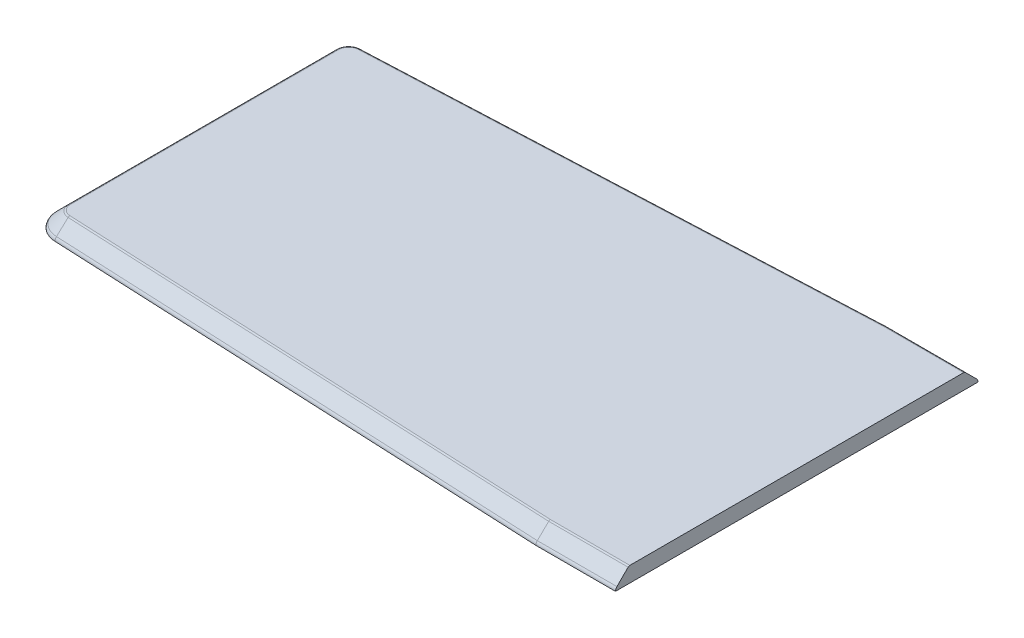
ISO-10303-21;
HEADER;
FILE_DESCRIPTION(('STEP AP214'),'2;1');
FILE_NAME('part.step','',(''),(''),'','','');
FILE_SCHEMA(('AUTOMOTIVE_DESIGN { 1 0 10303 214 1 1 1 1 }'));
ENDSEC;
DATA;
#1=APPLICATION_CONTEXT('core data for automotive mechanical design processes');
#2=APPLICATION_PROTOCOL_DEFINITION('international standard','automotive_design',2000,#1);
#3=PRODUCT_CONTEXT('',#1,'mechanical');
#4=PRODUCT('Part','Part','',(#3));
#5=PRODUCT_RELATED_PRODUCT_CATEGORY('part','',(#4));
#6=PRODUCT_DEFINITION_FORMATION('','',#4);
#7=PRODUCT_DEFINITION_CONTEXT('part definition',#1,'design');
#8=PRODUCT_DEFINITION('design','',#6,#7);
#9=PRODUCT_DEFINITION_SHAPE('','',#8);
#10=(LENGTH_UNIT() NAMED_UNIT(*) SI_UNIT(.MILLI.,.METRE.));
#11=(NAMED_UNIT(*) PLANE_ANGLE_UNIT() SI_UNIT($,.RADIAN.));
#12=(NAMED_UNIT(*) SI_UNIT($,.STERADIAN.) SOLID_ANGLE_UNIT());
#13=UNCERTAINTY_MEASURE_WITH_UNIT(LENGTH_MEASURE(1.E-05),#10,'distance_accuracy_value','');
#14=(GEOMETRIC_REPRESENTATION_CONTEXT(3) GLOBAL_UNCERTAINTY_ASSIGNED_CONTEXT((#13)) GLOBAL_UNIT_ASSIGNED_CONTEXT((#10,
#11,#12)) REPRESENTATION_CONTEXT('',''));
#15=CARTESIAN_POINT('',(0.,0.,0.));
#16=DIRECTION('',(0.,0.,1.));
#17=DIRECTION('',(1.,0.,0.));
#18=AXIS2_PLACEMENT_3D('',#15,#16,#17);
#19=CARTESIAN_POINT('',(-20.2949627924089,-0.253999999999999,14.0434754923325));
#20=DIRECTION('',(0.,-1.,0.));
#21=DIRECTION('',(0.,0.,-1.));
#22=AXIS2_PLACEMENT_3D('',#19,#20,#21);
#23=TOROIDAL_SURFACE('',#22,1.0377897551572,0.253999999999999);
#24=CARTESIAN_POINT('',(-21.3327525475661,-0.253999999999986,14.0434754923324));
#25=DIRECTION('',(0.,-1.84046289331525E-13,1.));
#26=DIRECTION('',(0.,-1.,-1.84046289331525E-13));
#27=AXIS2_PLACEMENT_3D('',#24,#25,#26);
#28=CIRCLE('',#27,0.253999999999988);
#29=CARTESIAN_POINT('',(-21.3327525475661,0.,14.0434754923325));
#30=VERTEX_POINT('',#29);
#31=CARTESIAN_POINT('',(-21.5123576700085,-0.0743948776107095,14.0434754923325));
#32=VERTEX_POINT('',#31);
#33=EDGE_CURVE('E139',#30,#32,#28,.T.);
#34=ORIENTED_EDGE('',*,*,#33,.T.);
#35=CARTESIAN_POINT('',(-20.2949627924089,-0.0743948776289471,14.0434754923325));
#36=DIRECTION('',(0.,-1.,0.));
#37=DIRECTION('',(0.,0.,-1.));
#38=AXIS2_PLACEMENT_3D('',#35,#36,#37);
#39=CIRCLE('',#38,1.21739487760293);
#40=CARTESIAN_POINT('',(-20.3501874617926,-0.0743948776756947,15.2596171469268));
#41=VERTEX_POINT('',#40);
#42=EDGE_CURVE('E148',#41,#32,#39,.T.);
#43=ORIENTED_EDGE('',*,*,#42,.F.);
#44=CARTESIAN_POINT('',(-20.3420400367522,-0.253999999999999,15.0801969153649));
#45=DIRECTION('',(-0.998970569790741,1.13105535473192E-13,-0.0453629881286821));
#46=DIRECTION('',(-0.0453629881286821,0.,0.998970569790741));
#47=AXIS2_PLACEMENT_3D('',#44,#45,#46);
#48=CIRCLE('',#47,0.253999999999999);
#49=CARTESIAN_POINT('',(-20.3420400367524,0.,15.0801969153649));
#50=VERTEX_POINT('',#49);
#51=EDGE_CURVE('E108',#41,#50,#48,.T.);
#52=ORIENTED_EDGE('',*,*,#51,.T.);
#53=CARTESIAN_POINT('',(-20.2949627924089,0.,14.0434754923325));
#54=DIRECTION('',(0.,-1.,0.));
#55=DIRECTION('',(0.,0.,-1.));
#56=AXIS2_PLACEMENT_3D('',#53,#54,#55);
#57=CIRCLE('',#56,1.0377897551572);
#58=EDGE_CURVE('E172',#50,#30,#57,.T.);
#59=ORIENTED_EDGE('',*,*,#58,.T.);
#60=EDGE_LOOP('',(#34,#43,#52,#59));
#61=FACE_BOUND('',#60,.T.);
#62=ADVANCED_FACE('F35',(#61),#23,.T.);
#63=CARTESIAN_POINT('',(-20.2949627924089,-0.253999999999973,-14.0434754923325));
#64=DIRECTION('',(0.,-1.,0.));
#65=DIRECTION('',(0.,0.,-1.));
#66=AXIS2_PLACEMENT_3D('',#63,#64,#65);
#67=TOROIDAL_SURFACE('',#66,1.03778975515721,0.253999999999976);
#68=CARTESIAN_POINT('',(-21.3327525475661,-0.253999999999973,-14.0434754923325));
#69=DIRECTION('',(0.,0.,-1.));
#70=DIRECTION('',(0.,1.,0.));
#71=AXIS2_PLACEMENT_3D('',#68,#69,#70);
#72=CIRCLE('',#71,0.253999999999976);
#73=CARTESIAN_POINT('',(-21.5123576699768,-0.0743948775736566,-14.0434754923325));
#74=VERTEX_POINT('',#73);
#75=CARTESIAN_POINT('',(-21.3327525475661,0.,-14.0434754923325));
#76=VERTEX_POINT('',#75);
#77=EDGE_CURVE('E207',#74,#76,#72,.T.);
#78=ORIENTED_EDGE('',*,*,#77,.T.);
#79=CARTESIAN_POINT('',(-20.2949627924089,0.,-14.0434754923325));
#80=DIRECTION('',(0.,-1.,0.));
#81=DIRECTION('',(0.,0.,-1.));
#82=AXIS2_PLACEMENT_3D('',#79,#80,#81);
#83=CIRCLE('',#82,1.03778975515721);
#84=CARTESIAN_POINT('',(-20.3420400367527,0.,-15.0801969153649));
#85=VERTEX_POINT('',#84);
#86=EDGE_CURVE('E206',#76,#85,#83,.T.);
#87=ORIENTED_EDGE('',*,*,#86,.T.);
#88=CARTESIAN_POINT('',(-20.3420400367527,-0.254000000000003,-15.0801969153649));
#89=DIRECTION('',(-0.998970569790709,-2.085180915848E-13,0.0453629881293746));
#90=DIRECTION('',(0.0453629881293746,0.,0.998970569790709));
#91=AXIS2_PLACEMENT_3D('',#88,#89,#90);
#92=CIRCLE('',#91,0.254000000000002);
#93=CARTESIAN_POINT('',(-20.3501874617874,-0.0743948775482951,-15.2596171468191));
#94=VERTEX_POINT('',#93);
#95=EDGE_CURVE('E184',#85,#94,#92,.T.);
#96=ORIENTED_EDGE('',*,*,#95,.T.);
#97=CARTESIAN_POINT('',(-20.2949627924089,-0.0743948775721037,-14.0434754923325));
#98=DIRECTION('',(0.,-1.,0.));
#99=DIRECTION('',(0.,0.,-1.));
#100=AXIS2_PLACEMENT_3D('',#97,#98,#99);
#101=CIRCLE('',#100,1.21739487756771);
#102=EDGE_CURVE('E176',#74,#94,#101,.T.);
#103=ORIENTED_EDGE('',*,*,#102,.F.);
#104=EDGE_LOOP('',(#78,#87,#96,#103));
#105=FACE_BOUND('',#104,.T.);
#106=ADVANCED_FACE('F347',(#105),#67,.T.);
#107=CARTESIAN_POINT('',(-20.2949627924089,-1.24821024479616,14.0434754923325));
#108=DIRECTION('',(0.,-1.,0.));
#109=DIRECTION('',(0.,0.,-1.));
#110=AXIS2_PLACEMENT_3D('',#107,#108,#109);
#111=CONICAL_SURFACE('',#110,2.39121024488382,0.785398163445875);
#112=DIRECTION('',(0.0320764765218441,0.707106781169426,-0.706378864121908));
#113=VECTOR('',#112,1.);
#114=CARTESIAN_POINT('',(-22656.4778902727,-499000.,498501.49964856));
#115=LINE('',#114,#113);
#116=CARTESIAN_POINT('',(-20.4034352343629,-1.24821024487762,16.4322241531575));
#117=VERTEX_POINT('',#116);
#118=EDGE_CURVE('E145',#117,#41,#115,.T.);
#119=ORIENTED_EDGE('',*,*,#118,.T.);
#120=ORIENTED_EDGE('',*,*,#42,.T.);
#121=DIRECTION('',(0.707106781203669,0.707106781169426,0.));
#122=VECTOR('',#121,1.);
#123=CARTESIAN_POINT('',(-499021.437986957,-499000.,14.0434754924242));
#124=LINE('',#123,#122);
#125=CARTESIAN_POINT('',(-22.6861730372638,-1.24821024483114,14.0434754923325));
#126=VERTEX_POINT('',#125);
#127=EDGE_CURVE('E155',#32,#126,#124,.F.);
#128=ORIENTED_EDGE('',*,*,#127,.T.);
#129=CARTESIAN_POINT('',(-20.2949627924089,-1.2482102448428,14.0434754923325));
#130=DIRECTION('',(0.,-1.,0.));
#131=DIRECTION('',(0.,0.,-1.));
#132=AXIS2_PLACEMENT_3D('',#129,#130,#131);
#133=CIRCLE('',#132,2.39121024484277);
#134=EDGE_CURVE('E151',#117,#126,#133,.T.);
#135=ORIENTED_EDGE('',*,*,#134,.F.);
#136=EDGE_LOOP('',(#119,#120,#128,#135));
#137=FACE_BOUND('',#136,.T.);
#138=ADVANCED_FACE('F147',(#137),#111,.T.);
#139=CARTESIAN_POINT('',(-20.2949627924089,-1.24821024479616,-14.0434754923325));
#140=DIRECTION('',(0.,-1.,0.));
#141=DIRECTION('',(0.,0.,-1.));
#142=AXIS2_PLACEMENT_3D('',#139,#140,#141);
#143=CONICAL_SURFACE('',#142,2.39121024484861,0.785398163421661);
#144=DIRECTION('',(0.0320764765218513,0.707106781169426,0.706378864121908));
#145=VECTOR('',#144,1.);
#146=CARTESIAN_POINT('',(-22655.7889852741,-498984.813500344,-498486.328782345));
#147=LINE('',#146,#145);
#148=CARTESIAN_POINT('',(-20.4034352343603,-1.2482102448312,-16.4322241531111));
#149=VERTEX_POINT('',#148);
#150=EDGE_CURVE('E240',#94,#149,#147,.F.);
#151=ORIENTED_EDGE('',*,*,#150,.T.);
#152=CARTESIAN_POINT('',(-20.2949627924089,-1.24821024484305,-14.0434754923325));
#153=DIRECTION('',(0.,-1.,0.));
#154=DIRECTION('',(1.,0.,0.));
#155=AXIS2_PLACEMENT_3D('',#152,#153,#154);
#156=CIRCLE('',#155,2.39121024484302);
#157=CARTESIAN_POINT('',(-22.6861730372497,-1.2482102448312,-14.0434754923325));
#158=VERTEX_POINT('',#157);
#159=EDGE_CURVE('E205',#158,#149,#156,.T.);
#160=ORIENTED_EDGE('',*,*,#159,.F.);
#161=DIRECTION('',(0.707106781203669,0.707106781169426,0.));
#162=VECTOR('',#161,1.);
#163=CARTESIAN_POINT('',(-499006.2514873,-498984.813500344,-14.0434754917976));
#164=LINE('',#163,#162);
#165=EDGE_CURVE('E174',#158,#74,#164,.T.);
#166=ORIENTED_EDGE('',*,*,#165,.T.);
#167=ORIENTED_EDGE('',*,*,#102,.T.);
#168=EDGE_LOOP('',(#151,#160,#166,#167));
#169=FACE_BOUND('',#168,.T.);
#170=ADVANCED_FACE('F340',(#169),#143,.T.);
#171=CARTESIAN_POINT('',(-20.2949627924089,-1.60742048968556,14.0434754923325));
#172=DIRECTION('',(0.,1.,0.));
#173=DIRECTION('',(0.,0.,1.));
#174=AXIS2_PLACEMENT_3D('',#171,#172,#173);
#175=TOROIDAL_SURFACE('',#174,2.03200000000001,0.50799999999999);
#176=CARTESIAN_POINT('',(-20.3871403842875,-1.60742048968558,16.0733836901472));
#177=DIRECTION('',(-0.998970569790715,0.,-0.0453629881292468));
#178=DIRECTION('',(-0.0453629881292468,0.,0.998970569790715));
#179=AXIS2_PLACEMENT_3D('',#176,#177,#178);
#180=CIRCLE('',#179,0.508);
#181=CARTESIAN_POINT('',(-20.4101847822572,-1.60742048968556,16.5808607396009));
#182=VERTEX_POINT('',#181);
#183=EDGE_CURVE('E204',#117,#182,#180,.F.);
#184=ORIENTED_EDGE('',*,*,#183,.F.);
#185=ORIENTED_EDGE('',*,*,#134,.T.);
#186=CARTESIAN_POINT('',(-22.3269627924089,-1.60742048968556,14.0434754923325));
#187=DIRECTION('',(0.,0.,-1.));
#188=DIRECTION('',(-1.,0.,0.));
#189=AXIS2_PLACEMENT_3D('',#186,#187,#188);
#190=CIRCLE('',#189,0.508000000000002);
#191=CARTESIAN_POINT('',(-22.8349627924089,-1.60742048968556,14.0434754923325));
#192=VERTEX_POINT('',#191);
#193=EDGE_CURVE('E274',#192,#126,#190,.T.);
#194=ORIENTED_EDGE('',*,*,#193,.F.);
#195=CARTESIAN_POINT('',(-20.2949627924089,-1.60742048968558,14.0434754923325));
#196=DIRECTION('',(0.,1.,0.));
#197=DIRECTION('',(0.,0.,1.));
#198=AXIS2_PLACEMENT_3D('',#195,#196,#197);
#199=CIRCLE('',#198,2.54);
#200=EDGE_CURVE('E271',#182,#192,#199,.F.);
#201=ORIENTED_EDGE('',*,*,#200,.F.);
#202=EDGE_LOOP('',(#184,#185,#194,#201));
#203=FACE_BOUND('',#202,.T.);
#204=ADVANCED_FACE('F343',(#203),#175,.T.);
#205=CARTESIAN_POINT('',(-20.2949627924089,-1.60742048968557,-14.0434754923325));
#206=DIRECTION('',(0.,1.,0.));
#207=DIRECTION('',(-1.,0.,0.));
#208=AXIS2_PLACEMENT_3D('',#205,#206,#207);
#209=TOROIDAL_SURFACE('',#208,2.03200000000004,0.507999999999963);
#210=CARTESIAN_POINT('',(-20.3871403842875,-1.60742048968558,-16.0733836901472));
#211=DIRECTION('',(-0.998970569790715,0.,0.0453629881292468));
#212=DIRECTION('',(0.0453629881292468,0.,0.998970569790715));
#213=AXIS2_PLACEMENT_3D('',#210,#211,#212);
#214=CIRCLE('',#213,0.508);
#215=CARTESIAN_POINT('',(-20.4101847822572,-1.60742048968556,-16.5808607396009));
#216=VERTEX_POINT('',#215);
#217=EDGE_CURVE('E277',#216,#149,#214,.F.);
#218=ORIENTED_EDGE('',*,*,#217,.F.);
#219=CARTESIAN_POINT('',(-20.2949627924089,-1.60742048968557,-14.0434754923325));
#220=DIRECTION('',(0.,1.,0.));
#221=DIRECTION('',(0.,0.,1.));
#222=AXIS2_PLACEMENT_3D('',#219,#220,#221);
#223=CIRCLE('',#222,2.54);
#224=CARTESIAN_POINT('',(-22.8349627924089,-1.60742048968556,-14.0434754923325));
#225=VERTEX_POINT('',#224);
#226=EDGE_CURVE('E293',#225,#216,#223,.F.);
#227=ORIENTED_EDGE('',*,*,#226,.F.);
#228=CARTESIAN_POINT('',(-22.3269627924089,-1.60742048968556,-14.0434754923325));
#229=DIRECTION('',(0.,0.,-1.));
#230=DIRECTION('',(-1.,0.,0.));
#231=AXIS2_PLACEMENT_3D('',#228,#229,#230);
#232=CIRCLE('',#231,0.508000000000002);
#233=EDGE_CURVE('E278',#158,#225,#232,.F.);
#234=ORIENTED_EDGE('',*,*,#233,.F.);
#235=ORIENTED_EDGE('',*,*,#159,.T.);
#236=EDGE_LOOP('',(#218,#227,#234,#235));
#237=FACE_BOUND('',#236,.T.);
#238=ADVANCED_FACE('F37',(#237),#209,.T.);
#239=CARTESIAN_POINT('',(76.6847186902732,-1.60742048968556,18.4676003163647));
#240=DIRECTION('',(-1.,0.,0.));
#241=DIRECTION('',(0.,0.,1.));
#242=AXIS2_PLACEMENT_3D('',#239,#240,#241);
#243=CYLINDRICAL_SURFACE('',#242,0.508000000000002);
#244=CARTESIAN_POINT('',(40.6650372075911,-1.60742048968556,18.4676003163647));
#245=DIRECTION('',(-1.,0.,0.));
#246=DIRECTION('',(0.,0.,1.));
#247=AXIS2_PLACEMENT_3D('',#244,#245,#246);
#248=CIRCLE('',#247,0.508000000000002);
#249=CARTESIAN_POINT('',(40.6650372075911,-1.60742048968556,18.9756003163647));
#250=VERTEX_POINT('',#249);
#251=CARTESIAN_POINT('',(40.6650372075911,-1.2482102448428,18.8268105612075));
#252=VERTEX_POINT('',#251);
#253=EDGE_CURVE('E202',#250,#252,#248,.T.);
#254=ORIENTED_EDGE('',*,*,#253,.T.);
#255=DIRECTION('',(1.,0.,0.));
#256=VECTOR('',#255,1.);
#257=CARTESIAN_POINT('',(-22.8349627924089,-1.2482102448428,18.8268105612075));
#258=LINE('',#257,#256);
#259=CARTESIAN_POINT('',(32.3294522397187,-1.24821024484282,18.8268105612074));
#260=VERTEX_POINT('',#259);
#261=EDGE_CURVE('E307',#252,#260,#258,.F.);
#262=ORIENTED_EDGE('',*,*,#261,.T.);
#263=CARTESIAN_POINT('',(32.3260757278338,-1.60742048968558,18.9756003163647));
#264=CARTESIAN_POINT('',(32.326075720097,-1.59953559859638,18.9756004602101));
#265=CARTESIAN_POINT('',(32.3260796312705,-1.59165071420106,18.9754167330627));
#266=CARTESIAN_POINT('',(32.3260954862385,-1.57584112848617,18.9746799208705));
#267=CARTESIAN_POINT('',(32.3261074878612,-1.56791655105397,18.97412417696));
#268=CARTESIAN_POINT('',(32.3261398386846,-1.55204545032391,18.9726364067087));
#269=CARTESIAN_POINT('',(32.3261602471526,-1.54409917742847,18.9717017095456));
#270=CARTESIAN_POINT('',(32.3262096772397,-1.52820322607462,18.9694501566977));
#271=CARTESIAN_POINT('',(32.3262387591829,-1.52025392663587,18.9681306259641));
#272=CARTESIAN_POINT('',(32.3263057645063,-1.50437111186466,18.965104362101));
#273=CARTESIAN_POINT('',(32.3263437489813,-1.49643810607115,18.9633949556816));
#274=CARTESIAN_POINT('',(32.3264287438687,-1.48060767716884,18.9595848582972));
#275=CARTESIAN_POINT('',(32.3264758158227,-1.47271089568253,18.9574815025306));
#276=CARTESIAN_POINT('',(32.326579124966,-1.45697328263641,18.9528804208989));
#277=CARTESIAN_POINT('',(32.3266354238189,-1.44913322602213,18.9503800455081));
#278=CARTESIAN_POINT('',(32.3267572781233,-1.43352995286496,18.9449828948273));
#279=CARTESIAN_POINT('',(32.3268228950256,-1.42576764547823,18.9420834923));
#280=CARTESIAN_POINT('',(32.3269634265621,-1.4103412340726,18.9358873641133));
#281=CARTESIAN_POINT('',(32.3270384020925,-1.40267817394067,18.9325880406766));
#282=CARTESIAN_POINT('',(32.3271976394654,-1.38747203915708,18.925592305075));
#283=CARTESIAN_POINT('',(32.3272819613012,-1.37993014325695,18.92189333192));
#284=CARTESIAN_POINT('',(32.3274598251341,-1.36498847961361,18.914099736931));
#285=CARTESIAN_POINT('',(32.3275534258678,-1.35759002522014,18.9100025983509));
#286=CARTESIAN_POINT('',(32.3277497244444,-1.34295768351517,18.9014153658114));
#287=CARTESIAN_POINT('',(32.3278524794083,-1.33572524345758,18.8969228069294));
#288=CARTESIAN_POINT('',(32.3280669048054,-1.32144760328891,18.8875487181609));
#289=CARTESIAN_POINT('',(32.3281786303832,-1.31440398324177,18.8826647828076));
#290=CARTESIAN_POINT('',(32.3284107538833,-1.3005267993857,18.8725132776904));
#291=CARTESIAN_POINT('',(32.328531204603,-1.2936949467818,18.8672433697541));
#292=CARTESIAN_POINT('',(32.3287804761314,-1.28026425299219,18.8563265664568));
#293=CARTESIAN_POINT('',(32.3289093470451,-1.27366725249649,18.8506774075746));
#294=CARTESIAN_POINT('',(32.3291750808957,-1.26072900847476,18.8390103892465));
#295=CARTESIAN_POINT('',(32.3293119907992,-1.2543897312189,18.8329903502619));
#296=CARTESIAN_POINT('',(32.3294522397224,-1.24821024484284,18.8268105612075));
#297=B_SPLINE_CURVE_WITH_KNOTS('',3,(#263,#264,#265,#266,#267,#268,#269,#270,#271,#272,#273,
#274,#275,#276,#277,#278,#279,#280,#281,#282,#283,#284,#285,#286,#287,#288,#289,#290,#291,#292,
#293,#294,#295,#296),.UNSPECIFIED.,.F.,.F.,(4,2,2,2,2,2,2,2,2,2,2,2,2,2,2,2,4),(0.,
0.0236525306334769,0.0474759408318611,0.0714702585061957,0.0956355109561967,0.119971724887197,
0.144478926426512,0.169157141139235,0.194006394043511,0.219026709625274,0.244218111852504,
0.269580624189009,0.295114269607735,0.320819070603648,0.346695049206207,0.372742226991394,
0.398960625093405),.UNSPECIFIED.);
#298=CARTESIAN_POINT('',(32.326075727832,-1.60742048968556,18.9756003163646));
#299=VERTEX_POINT('',#298);
#300=EDGE_CURVE('E283',#299,#260,#297,.T.);
#301=ORIENTED_EDGE('',*,*,#300,.F.);
#302=DIRECTION('',(-1.,0.,0.));
#303=VECTOR('',#302,1.);
#304=CARTESIAN_POINT('',(76.6847186902732,-1.60742048968558,18.9756003163647));
#305=LINE('',#304,#303);
#306=EDGE_CURVE('E117',#299,#250,#305,.F.);
#307=ORIENTED_EDGE('',*,*,#306,.T.);
#308=EDGE_LOOP('',(#254,#262,#301,#307));
#309=FACE_BOUND('',#308,.T.);
#310=ADVANCED_FACE('F334',(#309),#243,.T.);
#311=CARTESIAN_POINT('',(32.3491201258035,-1.60742048968558,18.468123266911));
#312=DIRECTION('',(-0.998970569790715,0.,-0.0453629881292468));
#313=DIRECTION('',(-0.0453629881292468,0.,0.998970569790715));
#314=AXIS2_PLACEMENT_3D('',#311,#312,#313);
#315=CYLINDRICAL_SURFACE('',#314,0.508);
#316=ORIENTED_EDGE('',*,*,#300,.T.);
#317=DIRECTION('',(-0.998970569790746,-6.83294786936584E-13,-0.0453629881285643));
#318=VECTOR('',#317,1.);
#319=CARTESIAN_POINT('',(32.3294522397224,-1.24821024484284,18.8268105612075));
#320=LINE('',#319,#318);
#321=EDGE_CURVE('E257',#260,#117,#320,.T.);
#322=ORIENTED_EDGE('',*,*,#321,.T.);
#323=ORIENTED_EDGE('',*,*,#183,.T.);
#324=DIRECTION('',(-0.998970569790715,0.,-0.0453629881292468));
#325=VECTOR('',#324,1.);
#326=CARTESIAN_POINT('',(32.3260757278339,-1.60742048968556,18.9756003163647));
#327=LINE('',#326,#325);
#328=EDGE_CURVE('E266',#182,#299,#327,.F.);
#329=ORIENTED_EDGE('',*,*,#328,.T.);
#330=EDGE_LOOP('',(#316,#322,#323,#329));
#331=FACE_BOUND('',#330,.T.);
#332=ADVANCED_FACE('F323',(#331),#315,.T.);
#333=CARTESIAN_POINT('',(-22.3269627924089,-1.60742048968556,19.05));
#334=DIRECTION('',(0.,0.,-1.));
#335=DIRECTION('',(-1.,0.,0.));
#336=AXIS2_PLACEMENT_3D('',#333,#334,#335);
#337=CYLINDRICAL_SURFACE('',#336,0.508000000000002);
#338=ORIENTED_EDGE('',*,*,#193,.T.);
#339=DIRECTION('',(0.,0.,1.));
#340=VECTOR('',#339,1.);
#341=CARTESIAN_POINT('',(-22.6861730372516,-1.2482102448428,19.05));
#342=LINE('',#341,#340);
#343=EDGE_CURVE('E253',#126,#158,#342,.F.);
#344=ORIENTED_EDGE('',*,*,#343,.T.);
#345=ORIENTED_EDGE('',*,*,#233,.T.);
#346=DIRECTION('',(0.,0.,-1.));
#347=VECTOR('',#346,1.);
#348=CARTESIAN_POINT('',(-22.8349627924089,-1.60742048968557,19.05));
#349=LINE('',#348,#347);
#350=EDGE_CURVE('E288',#225,#192,#349,.F.);
#351=ORIENTED_EDGE('',*,*,#350,.T.);
#352=EDGE_LOOP('',(#338,#344,#345,#351));
#353=FACE_BOUND('',#352,.T.);
#354=ADVANCED_FACE('F333',(#353),#337,.T.);
#355=CARTESIAN_POINT('',(32.3491201258035,-1.60742048968558,-18.468123266911));
#356=DIRECTION('',(-0.998970569790715,0.,0.0453629881292468));
#357=DIRECTION('',(0.0453629881292468,0.,0.998970569790715));
#358=AXIS2_PLACEMENT_3D('',#355,#356,#357);
#359=CYLINDRICAL_SURFACE('',#358,0.508);
#360=CARTESIAN_POINT('',(32.3260757278338,-1.60742048968556,-18.9756003163647));
#361=CARTESIAN_POINT('',(32.3260757358811,-1.59953519995174,-18.975600460441));
#362=CARTESIAN_POINT('',(32.3260801695091,-1.59164991692258,-18.975416726415));
#363=CARTESIAN_POINT('',(32.3260977668045,-1.57583958963069,-18.9746798816196));
#364=CARTESIAN_POINT('',(32.3261109932498,-1.56791466915194,-18.9741241144541));
#365=CARTESIAN_POINT('',(32.3261461756655,-1.55204293992752,-18.9726362789587));
#366=CARTESIAN_POINT('',(32.3261681935204,-1.54409638137254,-18.9717015422527));
#367=CARTESIAN_POINT('',(32.3262209600102,-1.52819991753939,-18.9694498930867));
#368=CARTESIAN_POINT('',(32.3262517696674,-1.52025039095636,-18.9681303080037));
#369=CARTESIAN_POINT('',(32.3263221205145,-1.50436718128671,-18.9651039206695));
#370=CARTESIAN_POINT('',(32.3263617218787,-1.49643400729747,-18.9633944475352));
#371=CARTESIAN_POINT('',(32.3264496570062,-1.4806033012297,-18.9595842054863));
#372=CARTESIAN_POINT('',(32.326498050114,-1.47270641021105,-18.9574807741595));
#373=CARTESIAN_POINT('',(32.3266035695425,-1.45696863642909,-18.9528795347529));
#374=CARTESIAN_POINT('',(32.3266607543944,-1.44912852792391,-18.9503790795207));
#375=CARTESIAN_POINT('',(32.3267838581181,-1.43352520766893,-18.9449817681283));
#376=CARTESIAN_POINT('',(32.3268498347243,-1.42576290425974,-18.9420822870886));
#377=CARTESIAN_POINT('',(32.3269905227445,-1.41033655509102,-18.9358860075052));
#378=CARTESIAN_POINT('',(32.3270652911121,-1.40267355227174,-18.9325866135274));
#379=CARTESIAN_POINT('',(32.3272235634285,-1.38746758323119,-18.9255907501459));
#380=CARTESIAN_POINT('',(32.3273071235656,-1.37992579468093,-18.9218917220812));
#381=CARTESIAN_POINT('',(32.3274829801773,-1.36498439292996,-18.9140980392464));
#382=CARTESIAN_POINT('',(32.3275753320898,-1.35758609186252,-18.9100008700456));
#383=CARTESIAN_POINT('',(32.3277687730004,-1.34295409932287,-18.9014136078851));
#384=CARTESIAN_POINT('',(32.3278699167008,-1.33572185375048,-18.8969210523043));
#385=CARTESIAN_POINT('',(32.3280809418956,-1.32144463964403,-18.8875470123476));
#386=CARTESIAN_POINT('',(32.328190877371,-1.31440124968102,-18.8826631247921));
#387=CARTESIAN_POINT('',(32.3284194869049,-1.30052455694327,-18.8725117690032));
#388=CARTESIAN_POINT('',(32.3285382142378,-1.29369296374141,-18.8672419648697));
#389=CARTESIAN_POINT('',(32.3287844079033,-1.28026281285884,-18.8563254352441));
#390=CARTESIAN_POINT('',(32.3289119268147,-1.27366609409632,-18.8506764484872));
#391=CARTESIAN_POINT('',(32.3291757053938,-1.2607284301673,-18.8390098539145));
#392=CARTESIAN_POINT('',(32.3293120169671,-1.25438944936159,-18.8329900687999));
#393=CARTESIAN_POINT('',(32.3294522397242,-1.2482102448428,-18.8268105612075));
#394=B_SPLINE_CURVE_WITH_KNOTS('',3,(#360,#361,#362,#363,#364,#365,#366,#367,#368,#369,#370,
#371,#372,#373,#374,#375,#376,#377,#378,#379,#380,#381,#382,#383,#384,#385,#386,#387,#388,#389,
#390,#391,#392,#393),.UNSPECIFIED.,.F.,.F.,(4,2,2,2,2,2,2,2,2,2,2,2,2,2,2,2,4),(0.,
0.0236537262262262,0.0474781726179967,0.0714733670810794,0.0956393369106486,0.119976108808196,
0.144483708897855,0.169162162742176,0.194011495357352,0.219031731227942,0.244222894321089,
0.269585008100277,0.295118095538617,0.320822179131713,0.34669728091009,0.37274342245123,
0.398960624891214),.UNSPECIFIED.);
#395=CARTESIAN_POINT('',(32.3260757278339,-1.60742048968556,-18.9756003163647));
#396=VERTEX_POINT('',#395);
#397=CARTESIAN_POINT('',(32.3294522397242,-1.2482102448428,-18.8268105612075));
#398=VERTEX_POINT('',#397);
#399=EDGE_CURVE('E201',#396,#398,#394,.T.);
#400=ORIENTED_EDGE('',*,*,#399,.F.);
#401=DIRECTION('',(0.998970569790715,0.,-0.0453629881292468));
#402=VECTOR('',#401,1.);
#403=CARTESIAN_POINT('',(32.3260757278339,-1.60742048968555,-18.9756003163647));
#404=LINE('',#403,#402);
#405=EDGE_CURVE('E298',#396,#216,#404,.F.);
#406=ORIENTED_EDGE('',*,*,#405,.T.);
#407=ORIENTED_EDGE('',*,*,#217,.T.);
#408=DIRECTION('',(0.998970569790715,0.,-0.0453629881292467));
#409=VECTOR('',#408,1.);
#410=CARTESIAN_POINT('',(-20.4034352343602,-1.24821024484281,-16.4322241531125));
#411=LINE('',#410,#409);
#412=EDGE_CURVE('E256',#149,#398,#411,.T.);
#413=ORIENTED_EDGE('',*,*,#412,.T.);
#414=EDGE_LOOP('',(#400,#406,#407,#413));
#415=FACE_BOUND('',#414,.T.);
#416=ADVANCED_FACE('F405',(#415),#359,.T.);
#417=CARTESIAN_POINT('',(76.6847186902732,-1.60742048968556,-18.4676003163647));
#418=DIRECTION('',(-1.,0.,0.));
#419=DIRECTION('',(0.,0.,1.));
#420=AXIS2_PLACEMENT_3D('',#417,#418,#419);
#421=CYLINDRICAL_SURFACE('',#420,0.508000000000002);
#422=CARTESIAN_POINT('',(40.6650372075911,-1.60742048968556,-18.4676003163647));
#423=DIRECTION('',(-1.,0.,0.));
#424=DIRECTION('',(0.,0.,1.));
#425=AXIS2_PLACEMENT_3D('',#422,#423,#424);
#426=CIRCLE('',#425,0.508000000000002);
#427=CARTESIAN_POINT('',(40.6650372075911,-1.2482102448428,-18.8268105612075));
#428=VERTEX_POINT('',#427);
#429=CARTESIAN_POINT('',(40.6650372075911,-1.60742048968556,-18.9756003163647));
#430=VERTEX_POINT('',#429);
#431=EDGE_CURVE('E198',#428,#430,#426,.T.);
#432=ORIENTED_EDGE('',*,*,#431,.T.);
#433=DIRECTION('',(1.,0.,0.));
#434=VECTOR('',#433,1.);
#435=CARTESIAN_POINT('',(76.6847186902732,-1.60742048968556,-18.9756003163647));
#436=LINE('',#435,#434);
#437=EDGE_CURVE('E299',#430,#396,#436,.F.);
#438=ORIENTED_EDGE('',*,*,#437,.T.);
#439=ORIENTED_EDGE('',*,*,#399,.T.);
#440=DIRECTION('',(1.,0.,0.));
#441=VECTOR('',#440,1.);
#442=CARTESIAN_POINT('',(-22.8349627924089,-1.24821024484281,-18.8268105612075));
#443=LINE('',#442,#441);
#444=EDGE_CURVE('E412',#398,#428,#443,.T.);
#445=ORIENTED_EDGE('',*,*,#444,.T.);
#446=EDGE_LOOP('',(#432,#438,#439,#445));
#447=FACE_BOUND('',#446,.T.);
#448=ADVANCED_FACE('F401',(#447),#421,.T.);
#449=CARTESIAN_POINT('',(-22.8349627924089,0.,17.5786003163647));
#450=DIRECTION('',(0.,-0.707106781186544,-0.707106781186551));
#451=DIRECTION('',(0.,0.707106781186551,-0.707106781186544));
#452=AXIS2_PLACEMENT_3D('',#449,#450,#451);
#453=PLANE('',#452);
#454=DIRECTION('',(-0.0160444321280357,-0.707015762270461,0.707015762270409));
#455=VECTOR('',#454,1.);
#456=CARTESIAN_POINT('',(32.3560898367831,-0.0743948775786183,17.6529951939433));
#457=LINE('',#456,#455);
#458=CARTESIAN_POINT('',(32.3560898364464,-0.0743948775862569,17.6529951939433));
#459=VERTEX_POINT('',#458);
#460=EDGE_CURVE('E161',#459,#260,#457,.T.);
#461=ORIENTED_EDGE('',*,*,#460,.T.);
#462=ORIENTED_EDGE('',*,*,#261,.F.);
#463=DIRECTION('',(0.,0.707106781186551,-0.707106781186544));
#464=VECTOR('',#463,1.);
#465=CARTESIAN_POINT('',(40.6650372075911,0.,17.5786003163647));
#466=LINE('',#465,#464);
#467=CARTESIAN_POINT('',(40.6650372075911,-0.0743948775786179,17.6529951939433));
#468=VERTEX_POINT('',#467);
#469=EDGE_CURVE('E302',#468,#252,#466,.F.);
#470=ORIENTED_EDGE('',*,*,#469,.F.);
#471=DIRECTION('',(1.,0.,0.));
#472=VECTOR('',#471,1.);
#473=CARTESIAN_POINT('',(-22.8349627924089,-0.0743948775786208,17.6529951939433));
#474=LINE('',#473,#472);
#475=EDGE_CURVE('E197',#459,#468,#474,.T.);
#476=ORIENTED_EDGE('',*,*,#475,.F.);
#477=EDGE_LOOP('',(#461,#462,#470,#476));
#478=FACE_BOUND('',#477,.T.);
#479=ADVANCED_FACE('F398',(#478),#453,.F.);
#480=CARTESIAN_POINT('',(32.3260757278339,-1.39700000000004,18.9756003163647));
#481=DIRECTION('',(0.0320764765210755,-0.707106781186543,-0.706378864104809));
#482=DIRECTION('',(0.,0.706742541498576,-0.707470833346601));
#483=AXIS2_PLACEMENT_3D('',#480,#481,#482);
#484=PLANE('',#483);
#485=ORIENTED_EDGE('',*,*,#118,.F.);
#486=ORIENTED_EDGE('',*,*,#321,.F.);
#487=ORIENTED_EDGE('',*,*,#460,.F.);
#488=DIRECTION('',(0.998970569790715,0.,0.0453629881292468));
#489=VECTOR('',#488,1.);
#490=CARTESIAN_POINT('',(-22.6580835310561,-0.0743948776091682,15.1548161996233));
#491=LINE('',#490,#489);
#492=EDGE_CURVE('E158',#41,#459,#491,.T.);
#493=ORIENTED_EDGE('',*,*,#492,.F.);
#494=EDGE_LOOP('',(#485,#486,#487,#493));
#495=FACE_BOUND('',#494,.T.);
#496=ADVANCED_FACE('F159',(#495),#484,.F.);
#497=CARTESIAN_POINT('',(-22.8349627924089,-1.39700000000004,19.05));
#498=DIRECTION('',(0.707106781186551,-0.707106781186544,0.));
#499=DIRECTION('',(0.707106781186544,0.707106781186551,0.));
#500=AXIS2_PLACEMENT_3D('',#497,#498,#499);
#501=PLANE('',#500);
#502=ORIENTED_EDGE('',*,*,#165,.F.);
#503=ORIENTED_EDGE('',*,*,#343,.F.);
#504=ORIENTED_EDGE('',*,*,#127,.F.);
#505=DIRECTION('',(0.,0.,1.));
#506=VECTOR('',#505,1.);
#507=CARTESIAN_POINT('',(-21.5123576699929,-0.0743948775840153,19.05));
#508=LINE('',#507,#506);
#509=EDGE_CURVE('E165',#74,#32,#508,.T.);
#510=ORIENTED_EDGE('',*,*,#509,.F.);
#511=EDGE_LOOP('',(#502,#503,#504,#510));
#512=FACE_BOUND('',#511,.T.);
#513=ADVANCED_FACE('F392',(#512),#501,.F.);
#514=CARTESIAN_POINT('',(32.3260757278339,-1.39700000000004,-18.9756003163647));
#515=DIRECTION('',(0.0320764765210755,-0.707106781186543,0.706378864104809));
#516=DIRECTION('',(0.,-0.706742541498576,-0.707470833346601));
#517=AXIS2_PLACEMENT_3D('',#514,#515,#516);
#518=PLANE('',#517);
#519=ORIENTED_EDGE('',*,*,#150,.F.);
#520=DIRECTION('',(0.998970569790715,0.,-0.0453629881292468));
#521=VECTOR('',#520,1.);
#522=CARTESIAN_POINT('',(-22.6580835310547,-0.0743948775786424,-15.1548161995928));
#523=LINE('',#522,#521);
#524=CARTESIAN_POINT('',(32.3560898367821,-0.0743948775786194,-17.6529951939433));
#525=VERTEX_POINT('',#524);
#526=EDGE_CURVE('E195',#525,#94,#523,.F.);
#527=ORIENTED_EDGE('',*,*,#526,.F.);
#528=DIRECTION('',(-0.0160444321256871,-0.707015762270465,-0.707015762270458));
#529=VECTOR('',#528,1.);
#530=CARTESIAN_POINT('',(32.356089836781,-0.0743948775785925,-17.6529951939433));
#531=LINE('',#530,#529);
#532=EDGE_CURVE('E420',#525,#398,#531,.T.);
#533=ORIENTED_EDGE('',*,*,#532,.T.);
#534=ORIENTED_EDGE('',*,*,#412,.F.);
#535=EDGE_LOOP('',(#519,#527,#533,#534));
#536=FACE_BOUND('',#535,.T.);
#537=ADVANCED_FACE('F388',(#536),#518,.F.);
#538=CARTESIAN_POINT('',(-22.8349627924089,0.,-17.5786003163647));
#539=DIRECTION('',(0.,-0.707106781186544,0.707106781186551));
#540=DIRECTION('',(0.,-0.707106781186551,-0.707106781186544));
#541=AXIS2_PLACEMENT_3D('',#538,#539,#540);
#542=PLANE('',#541);
#543=ORIENTED_EDGE('',*,*,#532,.F.);
#544=DIRECTION('',(1.,0.,0.));
#545=VECTOR('',#544,1.);
#546=CARTESIAN_POINT('',(-22.8349627924089,-0.0743948775786182,-17.6529951939433));
#547=LINE('',#546,#545);
#548=CARTESIAN_POINT('',(40.6650372075911,-0.0743948775786166,-17.6529951939433));
#549=VERTEX_POINT('',#548);
#550=EDGE_CURVE('E192',#549,#525,#547,.F.);
#551=ORIENTED_EDGE('',*,*,#550,.F.);
#552=DIRECTION('',(0.,-0.707106781186551,-0.707106781186544));
#553=VECTOR('',#552,1.);
#554=CARTESIAN_POINT('',(40.6650372075911,0.,-17.5786003163647));
#555=LINE('',#554,#553);
#556=EDGE_CURVE('E423',#428,#549,#555,.F.);
#557=ORIENTED_EDGE('',*,*,#556,.F.);
#558=ORIENTED_EDGE('',*,*,#444,.F.);
#559=EDGE_LOOP('',(#543,#551,#557,#558));
#560=FACE_BOUND('',#559,.T.);
#561=ADVANCED_FACE('F384',(#560),#542,.F.);
#562=CARTESIAN_POINT('',(-22.8349627924089,-0.254,17.4733900715219));
#563=DIRECTION('',(1.,0.,0.));
#564=DIRECTION('',(0.,0.,-1.));
#565=AXIS2_PLACEMENT_3D('',#562,#563,#564);
#566=CYLINDRICAL_SURFACE('',#565,0.254000000000001);
#567=CARTESIAN_POINT('',(40.6650372075911,-0.254,17.4733900715219));
#568=DIRECTION('',(1.,0.,0.));
#569=DIRECTION('',(0.,0.,-1.));
#570=AXIS2_PLACEMENT_3D('',#567,#568,#569);
#571=CIRCLE('',#570,0.254000000000001);
#572=CARTESIAN_POINT('',(40.6650372075911,0.,17.4733900715219));
#573=VERTEX_POINT('',#572);
#574=EDGE_CURVE('E189',#468,#573,#571,.F.);
#575=ORIENTED_EDGE('',*,*,#574,.T.);
#576=DIRECTION('',(1.,0.,0.));
#577=VECTOR('',#576,1.);
#578=CARTESIAN_POINT('',(-22.8349627924089,0.,17.4733900715219));
#579=LINE('',#578,#577);
#580=CARTESIAN_POINT('',(32.3601656471828,0.,17.4733900715219));
#581=VERTEX_POINT('',#580);
#582=EDGE_CURVE('E188',#573,#581,#579,.F.);
#583=ORIENTED_EDGE('',*,*,#582,.T.);
#584=CARTESIAN_POINT('',(32.3601656471824,-0.254,17.4733900715219));
#585=DIRECTION('',(0.999742609322698,0.,0.0226873335727779));
#586=DIRECTION('',(-0.0226873335727788,0.,0.999742609322698));
#587=AXIS2_PLACEMENT_3D('',#584,#585,#586);
#588=ELLIPSE('',#587,0.254065394063857,0.254);
#589=EDGE_CURVE('E166',#459,#581,#588,.F.);
#590=ORIENTED_EDGE('',*,*,#589,.F.);
#591=ORIENTED_EDGE('',*,*,#475,.T.);
#592=EDGE_LOOP('',(#575,#583,#590,#591));
#593=FACE_BOUND('',#592,.T.);
#594=ADVANCED_FACE('F381',(#593),#566,.T.);
#595=CARTESIAN_POINT('',(-22.6499361060184,-0.254,14.9753959681102));
#596=DIRECTION('',(0.998970569790715,0.,0.0453629881292468));
#597=DIRECTION('',(0.0453629881292468,0.,-0.998970569790715));
#598=AXIS2_PLACEMENT_3D('',#595,#596,#597);
#599=CYLINDRICAL_SURFACE('',#598,0.254);
#600=ORIENTED_EDGE('',*,*,#51,.F.);
#601=ORIENTED_EDGE('',*,*,#492,.T.);
#602=ORIENTED_EDGE('',*,*,#589,.T.);
#603=DIRECTION('',(-0.998970569790715,0.,-0.0453629881292451));
#604=VECTOR('',#603,1.);
#605=CARTESIAN_POINT('',(32.3601656471865,0.,17.473390071522));
#606=LINE('',#605,#604);
#607=EDGE_CURVE('E170',#581,#50,#606,.T.);
#608=ORIENTED_EDGE('',*,*,#607,.T.);
#609=EDGE_LOOP('',(#600,#601,#602,#608));
#610=FACE_BOUND('',#609,.T.);
#611=ADVANCED_FACE('F168',(#610),#599,.T.);
#612=CARTESIAN_POINT('',(-21.3327525475661,-0.254,19.05));
#613=DIRECTION('',(0.,0.,1.));
#614=DIRECTION('',(1.,0.,0.));
#615=AXIS2_PLACEMENT_3D('',#612,#613,#614);
#616=CYLINDRICAL_SURFACE('',#615,0.254000000000001);
#617=DIRECTION('',(0.,0.,-1.));
#618=VECTOR('',#617,1.);
#619=CARTESIAN_POINT('',(-21.3327525475661,0.,19.05));
#620=LINE('',#619,#618);
#621=EDGE_CURVE('E212',#30,#76,#620,.T.);
#622=ORIENTED_EDGE('',*,*,#621,.T.);
#623=ORIENTED_EDGE('',*,*,#77,.F.);
#624=ORIENTED_EDGE('',*,*,#509,.T.);
#625=ORIENTED_EDGE('',*,*,#33,.F.);
#626=EDGE_LOOP('',(#622,#623,#624,#625));
#627=FACE_BOUND('',#626,.T.);
#628=ADVANCED_FACE('F220',(#627),#616,.T.);
#629=CARTESIAN_POINT('',(-22.6499361060184,-0.254,-14.9753959681102));
#630=DIRECTION('',(0.998970569790715,0.,-0.0453629881292468));
#631=DIRECTION('',(-0.0453629881292468,0.,-0.998970569790715));
#632=AXIS2_PLACEMENT_3D('',#629,#630,#631);
#633=CYLINDRICAL_SURFACE('',#632,0.254);
#634=ORIENTED_EDGE('',*,*,#95,.F.);
#635=DIRECTION('',(0.998970569790715,0.,-0.0453629881292468));
#636=VECTOR('',#635,1.);
#637=CARTESIAN_POINT('',(-20.3420400367527,0.,-15.0801969153649));
#638=LINE('',#637,#636);
#639=CARTESIAN_POINT('',(32.3601656471824,0.,-17.4733900715219));
#640=VERTEX_POINT('',#639);
#641=EDGE_CURVE('E218',#85,#640,#638,.T.);
#642=ORIENTED_EDGE('',*,*,#641,.T.);
#643=CARTESIAN_POINT('',(32.3601656471824,-0.254,-17.4733900715219));
#644=DIRECTION('',(0.999742609322698,0.,-0.0226873335727779));
#645=DIRECTION('',(0.0226873335727788,0.,0.999742609322698));
#646=AXIS2_PLACEMENT_3D('',#643,#644,#645);
#647=ELLIPSE('',#646,0.254065394063857,0.254);
#648=EDGE_CURVE('E193',#525,#640,#647,.T.);
#649=ORIENTED_EDGE('',*,*,#648,.F.);
#650=ORIENTED_EDGE('',*,*,#526,.T.);
#651=EDGE_LOOP('',(#634,#642,#649,#650));
#652=FACE_BOUND('',#651,.T.);
#653=ADVANCED_FACE('F372',(#652),#633,.T.);
#654=CARTESIAN_POINT('',(-22.8349627924089,-0.254,-17.4733900715219));
#655=DIRECTION('',(1.,0.,0.));
#656=DIRECTION('',(0.,0.,-1.));
#657=AXIS2_PLACEMENT_3D('',#654,#655,#656);
#658=CYLINDRICAL_SURFACE('',#657,0.254000000000001);
#659=CARTESIAN_POINT('',(40.6650372075911,-0.254,-17.4733900715219));
#660=DIRECTION('',(1.,0.,0.));
#661=DIRECTION('',(0.,0.,-1.));
#662=AXIS2_PLACEMENT_3D('',#659,#660,#661);
#663=CIRCLE('',#662,0.254000000000001);
#664=CARTESIAN_POINT('',(40.6650372075911,0.,-17.4733900715219));
#665=VERTEX_POINT('',#664);
#666=EDGE_CURVE('E52',#665,#549,#663,.F.);
#667=ORIENTED_EDGE('',*,*,#666,.T.);
#668=ORIENTED_EDGE('',*,*,#550,.T.);
#669=ORIENTED_EDGE('',*,*,#648,.T.);
#670=DIRECTION('',(1.,0.,0.));
#671=VECTOR('',#670,1.);
#672=CARTESIAN_POINT('',(-22.8349627924089,0.,-17.4733900715219));
#673=LINE('',#672,#671);
#674=EDGE_CURVE('E455',#640,#665,#673,.T.);
#675=ORIENTED_EDGE('',*,*,#674,.T.);
#676=EDGE_LOOP('',(#667,#668,#669,#675));
#677=FACE_BOUND('',#676,.T.);
#678=ADVANCED_FACE('F367',(#677),#658,.T.);
#679=CARTESIAN_POINT('',(40.6650372075911,3.33058870561018,0.));
#680=DIRECTION('',(-1.,0.,0.));
#681=DIRECTION('',(0.,0.,1.));
#682=AXIS2_PLACEMENT_3D('',#679,#680,#681);
#683=PLANE('',#682);
#684=ORIENTED_EDGE('',*,*,#253,.F.);
#685=DIRECTION('',(0.,0.,-1.));
#686=VECTOR('',#685,1.);
#687=CARTESIAN_POINT('',(40.6650372075911,-1.60742048968556,0.));
#688=LINE('',#687,#686);
#689=EDGE_CURVE('E11',#250,#430,#688,.T.);
#690=ORIENTED_EDGE('',*,*,#689,.T.);
#691=ORIENTED_EDGE('',*,*,#431,.F.);
#692=ORIENTED_EDGE('',*,*,#556,.T.);
#693=ORIENTED_EDGE('',*,*,#666,.F.);
#694=DIRECTION('',(0.,0.,-1.));
#695=VECTOR('',#694,1.);
#696=CARTESIAN_POINT('',(40.6650372075911,0.,19.05));
#697=LINE('',#696,#695);
#698=EDGE_CURVE('E44',#665,#573,#697,.F.);
#699=ORIENTED_EDGE('',*,*,#698,.T.);
#700=ORIENTED_EDGE('',*,*,#574,.F.);
#701=ORIENTED_EDGE('',*,*,#469,.T.);
#702=EDGE_LOOP('',(#684,#690,#691,#692,#693,#699,#700,#701));
#703=FACE_BOUND('',#702,.T.);
#704=ADVANCED_FACE('F360',(#703),#683,.F.);
#705=CARTESIAN_POINT('',(-22.8349627924089,0.,19.05));
#706=DIRECTION('',(0.,-1.,0.));
#707=DIRECTION('',(0.,0.,-1.));
#708=AXIS2_PLACEMENT_3D('',#705,#706,#707);
#709=PLANE('',#708);
#710=ORIENTED_EDGE('',*,*,#674,.F.);
#711=ORIENTED_EDGE('',*,*,#641,.F.);
#712=ORIENTED_EDGE('',*,*,#86,.F.);
#713=ORIENTED_EDGE('',*,*,#621,.F.);
#714=ORIENTED_EDGE('',*,*,#58,.F.);
#715=ORIENTED_EDGE('',*,*,#607,.F.);
#716=ORIENTED_EDGE('',*,*,#582,.F.);
#717=ORIENTED_EDGE('',*,*,#698,.F.);
#718=EDGE_LOOP('',(#710,#711,#712,#713,#714,#715,#716,#717));
#719=FACE_BOUND('',#718,.T.);
#720=ADVANCED_FACE('F214',(#719),#709,.F.);
#721=CARTESIAN_POINT('',(40.6650372075911,-1.60742048968556,-18.9757033940056));
#722=DIRECTION('',(0.,1.,0.));
#723=DIRECTION('',(0.,0.,1.));
#724=AXIS2_PLACEMENT_3D('',#721,#722,#723);
#725=PLANE('',#724);
#726=ORIENTED_EDGE('',*,*,#689,.F.);
#727=ORIENTED_EDGE('',*,*,#306,.F.);
#728=ORIENTED_EDGE('',*,*,#328,.F.);
#729=ORIENTED_EDGE('',*,*,#200,.T.);
#730=ORIENTED_EDGE('',*,*,#350,.F.);
#731=ORIENTED_EDGE('',*,*,#226,.T.);
#732=ORIENTED_EDGE('',*,*,#405,.F.);
#733=ORIENTED_EDGE('',*,*,#437,.F.);
#734=EDGE_LOOP('',(#726,#727,#728,#729,#730,#731,#732,#733));
#735=FACE_BOUND('',#734,.T.);
#736=ADVANCED_FACE('F350',(#735),#725,.F.);
#737=CLOSED_SHELL('',(#62,#106,#138,#170,#204,#238,#310,#332,#354,#416,#448,#479,#496,#513,#537,
#561,#594,#611,#628,#653,#678,#704,#720,#736));
#738=MANIFOLD_SOLID_BREP('B2',#737);
#739=ADVANCED_BREP_SHAPE_REPRESENTATION('',(#18,#738),#14);
#740=SHAPE_DEFINITION_REPRESENTATION(#9,#739);
ENDSEC;
END-ISO-10303-21;
